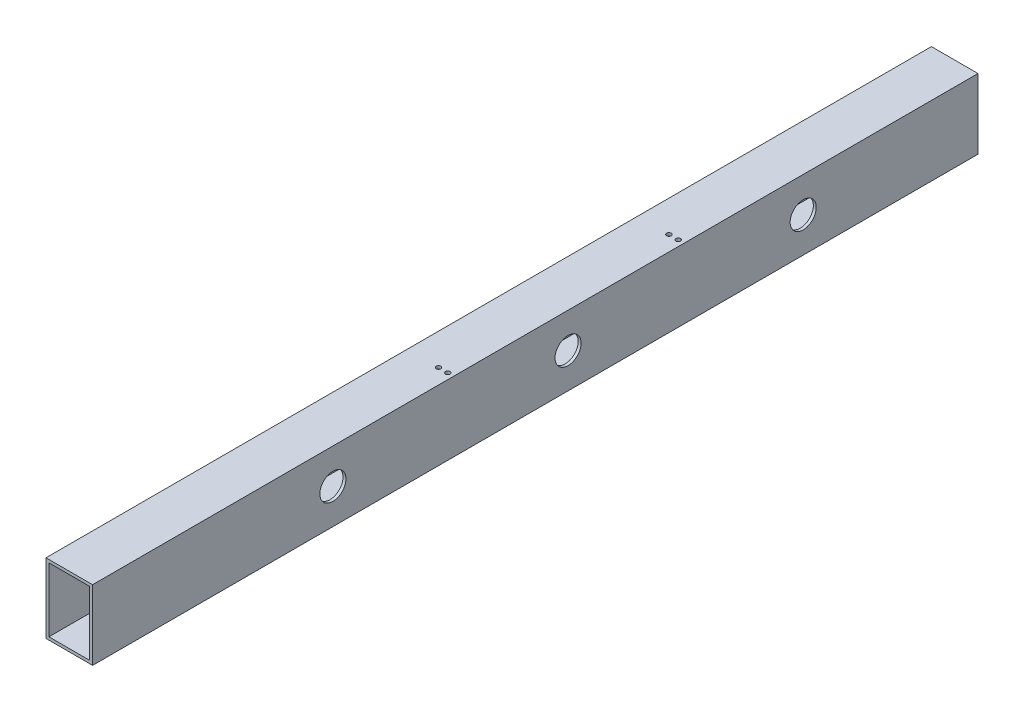
ISO-10303-21;
HEADER;
FILE_DESCRIPTION(('STEP AP214'),'2;1');
FILE_NAME('part.step','',(''),(''),'','','');
FILE_SCHEMA(('AUTOMOTIVE_DESIGN { 1 0 10303 214 1 1 1 1 }'));
ENDSEC;
DATA;
#1=APPLICATION_CONTEXT('core data for automotive mechanical design processes');
#2=APPLICATION_PROTOCOL_DEFINITION('international standard','automotive_design',2000,#1);
#3=PRODUCT_CONTEXT('',#1,'mechanical');
#4=PRODUCT('Part','Part','',(#3));
#5=PRODUCT_RELATED_PRODUCT_CATEGORY('part','',(#4));
#6=PRODUCT_DEFINITION_FORMATION('','',#4);
#7=PRODUCT_DEFINITION_CONTEXT('part definition',#1,'design');
#8=PRODUCT_DEFINITION('design','',#6,#7);
#9=PRODUCT_DEFINITION_SHAPE('','',#8);
#10=(LENGTH_UNIT() NAMED_UNIT(*) SI_UNIT(.MILLI.,.METRE.));
#11=(NAMED_UNIT(*) PLANE_ANGLE_UNIT() SI_UNIT($,.RADIAN.));
#12=(NAMED_UNIT(*) SI_UNIT($,.STERADIAN.) SOLID_ANGLE_UNIT());
#13=UNCERTAINTY_MEASURE_WITH_UNIT(LENGTH_MEASURE(1.E-05),#10,'distance_accuracy_value','');
#14=(GEOMETRIC_REPRESENTATION_CONTEXT(3) GLOBAL_UNCERTAINTY_ASSIGNED_CONTEXT((#13)) GLOBAL_UNIT_ASSIGNED_CONTEXT((#10,
#11,#12)) REPRESENTATION_CONTEXT('',''));
#15=CARTESIAN_POINT('',(0.,0.,0.));
#16=DIRECTION('',(0.,0.,1.));
#17=DIRECTION('',(1.,0.,0.));
#18=AXIS2_PLACEMENT_3D('',#15,#16,#17);
#19=CARTESIAN_POINT('',(0.,0.,965.2));
#20=DIRECTION('',(0.,0.,1.));
#21=DIRECTION('',(1.,0.,0.));
#22=AXIS2_PLACEMENT_3D('',#19,#20,#21);
#23=PLANE('',#22);
#24=DIRECTION('',(0.,1.,0.));
#25=VECTOR('',#24,1.);
#26=CARTESIAN_POINT('',(25.4,38.1,965.2));
#27=LINE('',#26,#25);
#28=CARTESIAN_POINT('',(25.4,-38.1,965.2));
#29=VERTEX_POINT('',#28);
#30=CARTESIAN_POINT('',(25.4,38.1,965.2));
#31=VERTEX_POINT('',#30);
#32=EDGE_CURVE('E141',#29,#31,#27,.T.);
#33=ORIENTED_EDGE('',*,*,#32,.T.);
#34=DIRECTION('',(-1.,0.,0.));
#35=VECTOR('',#34,1.);
#36=CARTESIAN_POINT('',(-25.4,38.1,965.2));
#37=LINE('',#36,#35);
#38=CARTESIAN_POINT('',(-25.4,38.1,965.2));
#39=VERTEX_POINT('',#38);
#40=EDGE_CURVE('E144',#31,#39,#37,.T.);
#41=ORIENTED_EDGE('',*,*,#40,.T.);
#42=DIRECTION('',(0.,-1.,0.));
#43=VECTOR('',#42,1.);
#44=CARTESIAN_POINT('',(-25.4,38.1,965.2));
#45=LINE('',#44,#43);
#46=CARTESIAN_POINT('',(-25.3999999999999,-38.1,965.2));
#47=VERTEX_POINT('',#46);
#48=EDGE_CURVE('E147',#39,#47,#45,.T.);
#49=ORIENTED_EDGE('',*,*,#48,.T.);
#50=DIRECTION('',(1.,0.,0.));
#51=VECTOR('',#50,1.);
#52=CARTESIAN_POINT('',(-25.3999999999999,-38.1,965.2));
#53=LINE('',#52,#51);
#54=EDGE_CURVE('E149',#47,#29,#53,.T.);
#55=ORIENTED_EDGE('',*,*,#54,.T.);
#56=EDGE_LOOP('',(#33,#41,#49,#55));
#57=FACE_BOUND('',#56,.T.);
#58=DIRECTION('',(1.,0.,0.));
#59=VECTOR('',#58,1.);
#60=CARTESIAN_POINT('',(-22.225,-34.925,965.2));
#61=LINE('',#60,#59);
#62=CARTESIAN_POINT('',(-22.225,-34.925,965.2));
#63=VERTEX_POINT('',#62);
#64=CARTESIAN_POINT('',(22.225,-34.925,965.2));
#65=VERTEX_POINT('',#64);
#66=EDGE_CURVE('E111',#63,#65,#61,.T.);
#67=ORIENTED_EDGE('',*,*,#66,.F.);
#68=DIRECTION('',(0.,-1.,0.));
#69=VECTOR('',#68,1.);
#70=CARTESIAN_POINT('',(-22.225,34.925,965.2));
#71=LINE('',#70,#69);
#72=CARTESIAN_POINT('',(-22.225,34.925,965.2));
#73=VERTEX_POINT('',#72);
#74=EDGE_CURVE('E103',#73,#63,#71,.T.);
#75=ORIENTED_EDGE('',*,*,#74,.F.);
#76=DIRECTION('',(-1.,0.,0.));
#77=VECTOR('',#76,1.);
#78=CARTESIAN_POINT('',(-22.225,34.925,965.2));
#79=LINE('',#78,#77);
#80=CARTESIAN_POINT('',(22.225,34.925,965.2));
#81=VERTEX_POINT('',#80);
#82=EDGE_CURVE('E125',#81,#73,#79,.T.);
#83=ORIENTED_EDGE('',*,*,#82,.F.);
#84=DIRECTION('',(0.,1.,0.));
#85=VECTOR('',#84,1.);
#86=CARTESIAN_POINT('',(22.225,34.925,965.2));
#87=LINE('',#86,#85);
#88=EDGE_CURVE('E123',#65,#81,#87,.T.);
#89=ORIENTED_EDGE('',*,*,#88,.F.);
#90=EDGE_LOOP('',(#67,#75,#83,#89));
#91=FACE_BOUND('',#90,.T.);
#92=ADVANCED_FACE('F36',(#57,#91),#23,.T.);
#93=CARTESIAN_POINT('',(0.,0.,0.));
#94=DIRECTION('',(0.,0.,1.));
#95=DIRECTION('',(1.,0.,0.));
#96=AXIS2_PLACEMENT_3D('',#93,#94,#95);
#97=PLANE('',#96);
#98=DIRECTION('',(0.,1.,0.));
#99=VECTOR('',#98,1.);
#100=CARTESIAN_POINT('',(25.4,38.1,0.));
#101=LINE('',#100,#99);
#102=CARTESIAN_POINT('',(25.4,-38.1,0.));
#103=VERTEX_POINT('',#102);
#104=CARTESIAN_POINT('',(25.4,38.1,0.));
#105=VERTEX_POINT('',#104);
#106=EDGE_CURVE('E119',#103,#105,#101,.T.);
#107=ORIENTED_EDGE('',*,*,#106,.F.);
#108=DIRECTION('',(1.,0.,0.));
#109=VECTOR('',#108,1.);
#110=CARTESIAN_POINT('',(-25.3999999999999,-38.1,0.));
#111=LINE('',#110,#109);
#112=CARTESIAN_POINT('',(-25.3999999999999,-38.1,0.));
#113=VERTEX_POINT('',#112);
#114=EDGE_CURVE('E145',#113,#103,#111,.T.);
#115=ORIENTED_EDGE('',*,*,#114,.F.);
#116=DIRECTION('',(0.,-1.,0.));
#117=VECTOR('',#116,1.);
#118=CARTESIAN_POINT('',(-25.4,38.1,0.));
#119=LINE('',#118,#117);
#120=CARTESIAN_POINT('',(-25.4,38.1,0.));
#121=VERTEX_POINT('',#120);
#122=EDGE_CURVE('E156',#121,#113,#119,.T.);
#123=ORIENTED_EDGE('',*,*,#122,.F.);
#124=DIRECTION('',(-1.,0.,0.));
#125=VECTOR('',#124,1.);
#126=CARTESIAN_POINT('',(-25.4,38.1,0.));
#127=LINE('',#126,#125);
#128=EDGE_CURVE('E154',#105,#121,#127,.T.);
#129=ORIENTED_EDGE('',*,*,#128,.F.);
#130=EDGE_LOOP('',(#107,#115,#123,#129));
#131=FACE_BOUND('',#130,.T.);
#132=DIRECTION('',(0.,-1.,0.));
#133=VECTOR('',#132,1.);
#134=CARTESIAN_POINT('',(-22.225,34.925,0.));
#135=LINE('',#134,#133);
#136=CARTESIAN_POINT('',(-22.225,34.925,0.));
#137=VERTEX_POINT('',#136);
#138=CARTESIAN_POINT('',(-22.225,-34.925,0.));
#139=VERTEX_POINT('',#138);
#140=EDGE_CURVE('E61',#137,#139,#135,.T.);
#141=ORIENTED_EDGE('',*,*,#140,.T.);
#142=DIRECTION('',(1.,0.,0.));
#143=VECTOR('',#142,1.);
#144=CARTESIAN_POINT('',(-22.225,-34.925,0.));
#145=LINE('',#144,#143);
#146=CARTESIAN_POINT('',(22.225,-34.925,0.));
#147=VERTEX_POINT('',#146);
#148=EDGE_CURVE('E118',#139,#147,#145,.T.);
#149=ORIENTED_EDGE('',*,*,#148,.T.);
#150=DIRECTION('',(0.,1.,0.));
#151=VECTOR('',#150,1.);
#152=CARTESIAN_POINT('',(22.225,34.925,0.));
#153=LINE('',#152,#151);
#154=CARTESIAN_POINT('',(22.225,34.925,0.));
#155=VERTEX_POINT('',#154);
#156=EDGE_CURVE('E133',#147,#155,#153,.T.);
#157=ORIENTED_EDGE('',*,*,#156,.T.);
#158=DIRECTION('',(-1.,0.,0.));
#159=VECTOR('',#158,1.);
#160=CARTESIAN_POINT('',(-22.225,34.925,0.));
#161=LINE('',#160,#159);
#162=EDGE_CURVE('E112',#155,#137,#161,.T.);
#163=ORIENTED_EDGE('',*,*,#162,.T.);
#164=EDGE_LOOP('',(#141,#149,#157,#163));
#165=FACE_BOUND('',#164,.T.);
#166=ADVANCED_FACE('F203',(#131,#165),#97,.F.);
#167=CARTESIAN_POINT('',(25.4,38.1,965.2));
#168=DIRECTION('',(-1.,0.,0.));
#169=DIRECTION('',(0.,-1.,0.));
#170=AXIS2_PLACEMENT_3D('',#167,#168,#169);
#171=PLANE('',#170);
#172=CARTESIAN_POINT('',(25.4,0.,703.246600732606));
#173=DIRECTION('',(1.,0.,0.));
#174=DIRECTION('',(0.,1.,0.));
#175=AXIS2_PLACEMENT_3D('',#172,#173,#174);
#176=CIRCLE('',#175,14.2240000000001);
#177=CARTESIAN_POINT('',(25.4,14.2240000000001,703.246600732606));
#178=VERTEX_POINT('',#177);
#179=EDGE_CURVE('E285',#178,#178,#176,.T.);
#180=ORIENTED_EDGE('',*,*,#179,.F.);
#181=EDGE_LOOP('',(#180));
#182=FACE_BOUND('',#181,.T.);
#183=CARTESIAN_POINT('',(25.4,0.,190.549048410685));
#184=DIRECTION('',(1.,0.,0.));
#185=DIRECTION('',(0.,1.,0.));
#186=AXIS2_PLACEMENT_3D('',#183,#184,#185);
#187=CIRCLE('',#186,14.224);
#188=CARTESIAN_POINT('',(25.4,14.224,190.549048410685));
#189=VERTEX_POINT('',#188);
#190=EDGE_CURVE('E291',#189,#189,#187,.T.);
#191=ORIENTED_EDGE('',*,*,#190,.F.);
#192=EDGE_LOOP('',(#191));
#193=FACE_BOUND('',#192,.T.);
#194=CARTESIAN_POINT('',(25.4,0.,446.897824571646));
#195=DIRECTION('',(1.,0.,0.));
#196=DIRECTION('',(0.,1.,0.));
#197=AXIS2_PLACEMENT_3D('',#194,#195,#196);
#198=CIRCLE('',#197,14.224);
#199=CARTESIAN_POINT('',(25.4,14.224,446.897824571646));
#200=VERTEX_POINT('',#199);
#201=EDGE_CURVE('E277',#200,#200,#198,.T.);
#202=ORIENTED_EDGE('',*,*,#201,.F.);
#203=EDGE_LOOP('',(#202));
#204=FACE_BOUND('',#203,.T.);
#205=ORIENTED_EDGE('',*,*,#106,.T.);
#206=DIRECTION('',(0.,0.,-1.));
#207=VECTOR('',#206,1.);
#208=CARTESIAN_POINT('',(25.4,38.1,965.2));
#209=LINE('',#208,#207);
#210=EDGE_CURVE('E11',#31,#105,#209,.T.);
#211=ORIENTED_EDGE('',*,*,#210,.F.);
#212=ORIENTED_EDGE('',*,*,#32,.F.);
#213=DIRECTION('',(0.,0.,-1.));
#214=VECTOR('',#213,1.);
#215=CARTESIAN_POINT('',(25.4,-38.1,965.2));
#216=LINE('',#215,#214);
#217=EDGE_CURVE('E151',#29,#103,#216,.T.);
#218=ORIENTED_EDGE('',*,*,#217,.T.);
#219=EDGE_LOOP('',(#205,#211,#212,#218));
#220=FACE_BOUND('',#219,.T.);
#221=ADVANCED_FACE('F38',(#182,#193,#204,#220),#171,.F.);
#222=CARTESIAN_POINT('',(-25.4,38.1,965.2));
#223=DIRECTION('',(0.,-1.,0.));
#224=DIRECTION('',(0.,0.,-1.));
#225=AXIS2_PLACEMENT_3D('',#222,#223,#224);
#226=PLANE('',#225);
#227=CARTESIAN_POINT('',(8.88999999999853,38.1,320.473808194258));
#228=DIRECTION('',(0.,1.,0.));
#229=DIRECTION('',(0.,0.,-1.));
#230=AXIS2_PLACEMENT_3D('',#227,#228,#229);
#231=CIRCLE('',#230,2.50063000000005);
#232=CARTESIAN_POINT('',(8.88999999999853,38.1,317.973178194258));
#233=VERTEX_POINT('',#232);
#234=EDGE_CURVE('E247',#233,#233,#231,.T.);
#235=ORIENTED_EDGE('',*,*,#234,.F.);
#236=EDGE_LOOP('',(#235));
#237=FACE_BOUND('',#236,.T.);
#238=CARTESIAN_POINT('',(19.0499999999985,38.1,320.473808194258));
#239=DIRECTION('',(0.,1.,0.));
#240=DIRECTION('',(0.,0.,-1.));
#241=AXIS2_PLACEMENT_3D('',#238,#239,#240);
#242=CIRCLE('',#241,2.50063000000003);
#243=CARTESIAN_POINT('',(19.0499999999985,38.1,317.973178194258));
#244=VERTEX_POINT('',#243);
#245=EDGE_CURVE('E251',#244,#244,#242,.T.);
#246=ORIENTED_EDGE('',*,*,#245,.F.);
#247=EDGE_LOOP('',(#246));
#248=FACE_BOUND('',#247,.T.);
#249=CARTESIAN_POINT('',(19.0499999999999,38.1,571.614708402377));
#250=DIRECTION('',(0.,1.,0.));
#251=DIRECTION('',(0.,0.,1.));
#252=AXIS2_PLACEMENT_3D('',#249,#250,#251);
#253=CIRCLE('',#252,2.50063000000002);
#254=CARTESIAN_POINT('',(19.0499999999999,38.1,574.115338402377));
#255=VERTEX_POINT('',#254);
#256=EDGE_CURVE('E255',#255,#255,#253,.T.);
#257=ORIENTED_EDGE('',*,*,#256,.F.);
#258=EDGE_LOOP('',(#257));
#259=FACE_BOUND('',#258,.T.);
#260=CARTESIAN_POINT('',(8.8899999999999,38.1,571.614708402377));
#261=DIRECTION('',(0.,1.,0.));
#262=DIRECTION('',(0.,0.,1.));
#263=AXIS2_PLACEMENT_3D('',#260,#261,#262);
#264=CIRCLE('',#263,2.50063000000004);
#265=CARTESIAN_POINT('',(8.8899999999999,38.1,574.115338402377));
#266=VERTEX_POINT('',#265);
#267=EDGE_CURVE('E259',#266,#266,#264,.T.);
#268=ORIENTED_EDGE('',*,*,#267,.F.);
#269=EDGE_LOOP('',(#268));
#270=FACE_BOUND('',#269,.T.);
#271=ORIENTED_EDGE('',*,*,#128,.T.);
#272=DIRECTION('',(0.,0.,-1.));
#273=VECTOR('',#272,1.);
#274=CARTESIAN_POINT('',(-25.4,38.1,965.2));
#275=LINE('',#274,#273);
#276=EDGE_CURVE('E45',#39,#121,#275,.T.);
#277=ORIENTED_EDGE('',*,*,#276,.F.);
#278=ORIENTED_EDGE('',*,*,#40,.F.);
#279=ORIENTED_EDGE('',*,*,#210,.T.);
#280=EDGE_LOOP('',(#271,#277,#278,#279));
#281=FACE_BOUND('',#280,.T.);
#282=ADVANCED_FACE('F236',(#237,#248,#259,#270,#281),#226,.F.);
#283=CARTESIAN_POINT('',(-25.4,38.1,965.2));
#284=DIRECTION('',(1.,0.,0.));
#285=DIRECTION('',(0.,1.,0.));
#286=AXIS2_PLACEMENT_3D('',#283,#284,#285);
#287=PLANE('',#286);
#288=CARTESIAN_POINT('',(-25.4,0.,703.246600732606));
#289=DIRECTION('',(1.,0.,0.));
#290=DIRECTION('',(0.,1.,0.));
#291=AXIS2_PLACEMENT_3D('',#288,#289,#290);
#292=CIRCLE('',#291,14.2240000000001);
#293=CARTESIAN_POINT('',(-25.4,14.224,703.246600732606));
#294=VERTEX_POINT('',#293);
#295=EDGE_CURVE('E169',#294,#294,#292,.F.);
#296=ORIENTED_EDGE('',*,*,#295,.F.);
#297=EDGE_LOOP('',(#296));
#298=FACE_BOUND('',#297,.T.);
#299=CARTESIAN_POINT('',(-25.4,0.,190.549048410685));
#300=DIRECTION('',(1.,0.,0.));
#301=DIRECTION('',(0.,1.,0.));
#302=AXIS2_PLACEMENT_3D('',#299,#300,#301);
#303=CIRCLE('',#302,14.224);
#304=CARTESIAN_POINT('',(-25.4,14.224,190.549048410685));
#305=VERTEX_POINT('',#304);
#306=EDGE_CURVE('E288',#305,#305,#303,.F.);
#307=ORIENTED_EDGE('',*,*,#306,.F.);
#308=EDGE_LOOP('',(#307));
#309=FACE_BOUND('',#308,.T.);
#310=CARTESIAN_POINT('',(-25.4,0.,446.897824571646));
#311=DIRECTION('',(1.,0.,0.));
#312=DIRECTION('',(0.,1.,0.));
#313=AXIS2_PLACEMENT_3D('',#310,#311,#312);
#314=CIRCLE('',#313,14.224);
#315=CARTESIAN_POINT('',(-25.4,14.224,446.897824571646));
#316=VERTEX_POINT('',#315);
#317=EDGE_CURVE('E182',#316,#316,#314,.F.);
#318=ORIENTED_EDGE('',*,*,#317,.F.);
#319=EDGE_LOOP('',(#318));
#320=FACE_BOUND('',#319,.T.);
#321=ORIENTED_EDGE('',*,*,#122,.T.);
#322=DIRECTION('',(0.,0.,-1.));
#323=VECTOR('',#322,1.);
#324=CARTESIAN_POINT('',(-25.3999999999999,-38.1,965.2));
#325=LINE('',#324,#323);
#326=EDGE_CURVE('E161',#47,#113,#325,.T.);
#327=ORIENTED_EDGE('',*,*,#326,.F.);
#328=ORIENTED_EDGE('',*,*,#48,.F.);
#329=ORIENTED_EDGE('',*,*,#276,.T.);
#330=EDGE_LOOP('',(#321,#327,#328,#329));
#331=FACE_BOUND('',#330,.T.);
#332=ADVANCED_FACE('F233',(#298,#309,#320,#331),#287,.F.);
#333=CARTESIAN_POINT('',(-25.3999999999999,-38.1,965.2));
#334=DIRECTION('',(0.,1.,0.));
#335=DIRECTION('',(0.,0.,1.));
#336=AXIS2_PLACEMENT_3D('',#333,#334,#335);
#337=PLANE('',#336);
#338=ORIENTED_EDGE('',*,*,#114,.T.);
#339=ORIENTED_EDGE('',*,*,#217,.F.);
#340=ORIENTED_EDGE('',*,*,#54,.F.);
#341=ORIENTED_EDGE('',*,*,#326,.T.);
#342=EDGE_LOOP('',(#338,#339,#340,#341));
#343=FACE_BOUND('',#342,.T.);
#344=ADVANCED_FACE('F230',(#343),#337,.F.);
#345=CARTESIAN_POINT('',(-22.225,34.925,965.2));
#346=DIRECTION('',(1.,0.,0.));
#347=DIRECTION('',(0.,1.,0.));
#348=AXIS2_PLACEMENT_3D('',#345,#346,#347);
#349=PLANE('',#348);
#350=CARTESIAN_POINT('',(-22.225,0.,703.246600732606));
#351=DIRECTION('',(1.,0.,0.));
#352=DIRECTION('',(0.,1.,0.));
#353=AXIS2_PLACEMENT_3D('',#350,#351,#352);
#354=CIRCLE('',#353,14.2240000000001);
#355=CARTESIAN_POINT('',(-22.225,14.224,703.246600732606));
#356=VERTEX_POINT('',#355);
#357=EDGE_CURVE('E131',#356,#356,#354,.T.);
#358=ORIENTED_EDGE('',*,*,#357,.F.);
#359=EDGE_LOOP('',(#358));
#360=FACE_BOUND('',#359,.T.);
#361=CARTESIAN_POINT('',(-22.225,0.,190.549048410685));
#362=DIRECTION('',(1.,0.,0.));
#363=DIRECTION('',(0.,1.,0.));
#364=AXIS2_PLACEMENT_3D('',#361,#362,#363);
#365=CIRCLE('',#364,14.224);
#366=CARTESIAN_POINT('',(-22.225,14.224,190.549048410685));
#367=VERTEX_POINT('',#366);
#368=EDGE_CURVE('E172',#367,#367,#365,.T.);
#369=ORIENTED_EDGE('',*,*,#368,.F.);
#370=EDGE_LOOP('',(#369));
#371=FACE_BOUND('',#370,.T.);
#372=CARTESIAN_POINT('',(-22.225,0.,446.897824571646));
#373=DIRECTION('',(1.,0.,0.));
#374=DIRECTION('',(0.,1.,0.));
#375=AXIS2_PLACEMENT_3D('',#372,#373,#374);
#376=CIRCLE('',#375,14.224);
#377=CARTESIAN_POINT('',(-22.225,14.224,446.897824571646));
#378=VERTEX_POINT('',#377);
#379=EDGE_CURVE('E168',#378,#378,#376,.T.);
#380=ORIENTED_EDGE('',*,*,#379,.F.);
#381=EDGE_LOOP('',(#380));
#382=FACE_BOUND('',#381,.T.);
#383=ORIENTED_EDGE('',*,*,#140,.F.);
#384=DIRECTION('',(0.,0.,-1.));
#385=VECTOR('',#384,1.);
#386=CARTESIAN_POINT('',(-22.225,34.925,965.2));
#387=LINE('',#386,#385);
#388=EDGE_CURVE('E107',#73,#137,#387,.T.);
#389=ORIENTED_EDGE('',*,*,#388,.F.);
#390=ORIENTED_EDGE('',*,*,#74,.T.);
#391=DIRECTION('',(0.,0.,-1.));
#392=VECTOR('',#391,1.);
#393=CARTESIAN_POINT('',(-22.225,-34.925,965.2));
#394=LINE('',#393,#392);
#395=EDGE_CURVE('E106',#63,#139,#394,.T.);
#396=ORIENTED_EDGE('',*,*,#395,.T.);
#397=EDGE_LOOP('',(#383,#389,#390,#396));
#398=FACE_BOUND('',#397,.T.);
#399=ADVANCED_FACE('F105',(#360,#371,#382,#398),#349,.T.);
#400=CARTESIAN_POINT('',(-22.225,-34.925,965.2));
#401=DIRECTION('',(0.,1.,0.));
#402=DIRECTION('',(-1.,0.,0.));
#403=AXIS2_PLACEMENT_3D('',#400,#401,#402);
#404=PLANE('',#403);
#405=ORIENTED_EDGE('',*,*,#148,.F.);
#406=ORIENTED_EDGE('',*,*,#395,.F.);
#407=ORIENTED_EDGE('',*,*,#66,.T.);
#408=DIRECTION('',(0.,0.,-1.));
#409=VECTOR('',#408,1.);
#410=CARTESIAN_POINT('',(22.225,-34.925,965.2));
#411=LINE('',#410,#409);
#412=EDGE_CURVE('E120',#65,#147,#411,.T.);
#413=ORIENTED_EDGE('',*,*,#412,.T.);
#414=EDGE_LOOP('',(#405,#406,#407,#413));
#415=FACE_BOUND('',#414,.T.);
#416=ADVANCED_FACE('F115',(#415),#404,.T.);
#417=CARTESIAN_POINT('',(22.225,34.925,965.2));
#418=DIRECTION('',(-1.,0.,0.));
#419=DIRECTION('',(0.,-1.,0.));
#420=AXIS2_PLACEMENT_3D('',#417,#418,#419);
#421=PLANE('',#420);
#422=CARTESIAN_POINT('',(22.225,0.,703.246600732606));
#423=DIRECTION('',(-1.,0.,0.));
#424=DIRECTION('',(0.,-1.,0.));
#425=AXIS2_PLACEMENT_3D('',#422,#423,#424);
#426=CIRCLE('',#425,14.2240000000001);
#427=CARTESIAN_POINT('',(22.225,-14.224,703.246600732606));
#428=VERTEX_POINT('',#427);
#429=EDGE_CURVE('E40',#428,#428,#426,.T.);
#430=ORIENTED_EDGE('',*,*,#429,.F.);
#431=EDGE_LOOP('',(#430));
#432=FACE_BOUND('',#431,.T.);
#433=CARTESIAN_POINT('',(22.225,0.,190.549048410685));
#434=DIRECTION('',(-1.,0.,0.));
#435=DIRECTION('',(0.,-1.,0.));
#436=AXIS2_PLACEMENT_3D('',#433,#434,#435);
#437=CIRCLE('',#436,14.224);
#438=CARTESIAN_POINT('',(22.225,-14.224,190.549048410685));
#439=VERTEX_POINT('',#438);
#440=EDGE_CURVE('E170',#439,#439,#437,.T.);
#441=ORIENTED_EDGE('',*,*,#440,.F.);
#442=EDGE_LOOP('',(#441));
#443=FACE_BOUND('',#442,.T.);
#444=CARTESIAN_POINT('',(22.225,0.,446.897824571646));
#445=DIRECTION('',(-1.,0.,0.));
#446=DIRECTION('',(0.,-1.,0.));
#447=AXIS2_PLACEMENT_3D('',#444,#445,#446);
#448=CIRCLE('',#447,14.224);
#449=CARTESIAN_POINT('',(22.225,-14.224,446.897824571646));
#450=VERTEX_POINT('',#449);
#451=EDGE_CURVE('E166',#450,#450,#448,.T.);
#452=ORIENTED_EDGE('',*,*,#451,.F.);
#453=EDGE_LOOP('',(#452));
#454=FACE_BOUND('',#453,.T.);
#455=ORIENTED_EDGE('',*,*,#156,.F.);
#456=ORIENTED_EDGE('',*,*,#412,.F.);
#457=ORIENTED_EDGE('',*,*,#88,.T.);
#458=DIRECTION('',(0.,0.,-1.));
#459=VECTOR('',#458,1.);
#460=CARTESIAN_POINT('',(22.225,34.925,965.2));
#461=LINE('',#460,#459);
#462=EDGE_CURVE('E53',#81,#155,#461,.T.);
#463=ORIENTED_EDGE('',*,*,#462,.T.);
#464=EDGE_LOOP('',(#455,#456,#457,#463));
#465=FACE_BOUND('',#464,.T.);
#466=ADVANCED_FACE('F193',(#432,#443,#454,#465),#421,.T.);
#467=CARTESIAN_POINT('',(-22.225,34.925,965.2));
#468=DIRECTION('',(0.,-1.,0.));
#469=DIRECTION('',(1.,0.,0.));
#470=AXIS2_PLACEMENT_3D('',#467,#468,#469);
#471=PLANE('',#470);
#472=CARTESIAN_POINT('',(8.88999999999853,34.925,320.473808194258));
#473=DIRECTION('',(0.,-1.,0.));
#474=DIRECTION('',(1.,0.,0.));
#475=AXIS2_PLACEMENT_3D('',#472,#473,#474);
#476=CIRCLE('',#475,2.50063000000005);
#477=CARTESIAN_POINT('',(11.3906299999986,34.925,320.473808194258));
#478=VERTEX_POINT('',#477);
#479=EDGE_CURVE('E282',#478,#478,#476,.F.);
#480=ORIENTED_EDGE('',*,*,#479,.T.);
#481=EDGE_LOOP('',(#480));
#482=FACE_BOUND('',#481,.T.);
#483=CARTESIAN_POINT('',(19.0499999999985,34.925,320.473808194258));
#484=DIRECTION('',(0.,-1.,0.));
#485=DIRECTION('',(1.,0.,0.));
#486=AXIS2_PLACEMENT_3D('',#483,#484,#485);
#487=CIRCLE('',#486,2.50063000000003);
#488=CARTESIAN_POINT('',(21.5506299999986,34.925,320.473808194258));
#489=VERTEX_POINT('',#488);
#490=EDGE_CURVE('E336',#489,#489,#487,.F.);
#491=ORIENTED_EDGE('',*,*,#490,.T.);
#492=EDGE_LOOP('',(#491));
#493=FACE_BOUND('',#492,.T.);
#494=CARTESIAN_POINT('',(19.0499999999999,34.925,571.614708402377));
#495=DIRECTION('',(0.,-1.,0.));
#496=DIRECTION('',(1.,0.,0.));
#497=AXIS2_PLACEMENT_3D('',#494,#495,#496);
#498=CIRCLE('',#497,2.50063000000002);
#499=CARTESIAN_POINT('',(21.5506299999999,34.925,571.614708402377));
#500=VERTEX_POINT('',#499);
#501=EDGE_CURVE('E274',#500,#500,#498,.F.);
#502=ORIENTED_EDGE('',*,*,#501,.T.);
#503=EDGE_LOOP('',(#502));
#504=FACE_BOUND('',#503,.T.);
#505=CARTESIAN_POINT('',(8.8899999999999,34.925,571.614708402377));
#506=DIRECTION('',(0.,-1.,0.));
#507=DIRECTION('',(1.,0.,0.));
#508=AXIS2_PLACEMENT_3D('',#505,#506,#507);
#509=CIRCLE('',#508,2.50063000000004);
#510=CARTESIAN_POINT('',(11.3906299999999,34.925,571.614708402377));
#511=VERTEX_POINT('',#510);
#512=EDGE_CURVE('E273',#511,#511,#509,.F.);
#513=ORIENTED_EDGE('',*,*,#512,.T.);
#514=EDGE_LOOP('',(#513));
#515=FACE_BOUND('',#514,.T.);
#516=ORIENTED_EDGE('',*,*,#162,.F.);
#517=ORIENTED_EDGE('',*,*,#462,.F.);
#518=ORIENTED_EDGE('',*,*,#82,.T.);
#519=ORIENTED_EDGE('',*,*,#388,.T.);
#520=EDGE_LOOP('',(#516,#517,#518,#519));
#521=FACE_BOUND('',#520,.T.);
#522=ADVANCED_FACE('F196',(#482,#493,#504,#515,#521),#471,.T.);
#523=CARTESIAN_POINT('',(-65.6315474223899,0.,446.897824571646));
#524=DIRECTION('',(1.,0.,0.));
#525=DIRECTION('',(0.,1.,0.));
#526=AXIS2_PLACEMENT_3D('',#523,#524,#525);
#527=CYLINDRICAL_SURFACE('',#526,14.224);
#528=ORIENTED_EDGE('',*,*,#451,.T.);
#529=EDGE_LOOP('',(#528));
#530=FACE_BOUND('',#529,.T.);
#531=ORIENTED_EDGE('',*,*,#201,.T.);
#532=EDGE_LOOP('',(#531));
#533=FACE_BOUND('',#532,.T.);
#534=ADVANCED_FACE('F205',(#530,#533),#527,.F.);
#535=CARTESIAN_POINT('',(-65.6315474223899,0.,190.549048410685));
#536=DIRECTION('',(1.,0.,0.));
#537=DIRECTION('',(0.,1.,0.));
#538=AXIS2_PLACEMENT_3D('',#535,#536,#537);
#539=CYLINDRICAL_SURFACE('',#538,14.224);
#540=ORIENTED_EDGE('',*,*,#440,.T.);
#541=EDGE_LOOP('',(#540));
#542=FACE_BOUND('',#541,.T.);
#543=ORIENTED_EDGE('',*,*,#190,.T.);
#544=EDGE_LOOP('',(#543));
#545=FACE_BOUND('',#544,.T.);
#546=ADVANCED_FACE('F213',(#542,#545),#539,.F.);
#547=CARTESIAN_POINT('',(-65.6315474223899,0.,703.246600732606));
#548=DIRECTION('',(1.,0.,0.));
#549=DIRECTION('',(0.,1.,0.));
#550=AXIS2_PLACEMENT_3D('',#547,#548,#549);
#551=CYLINDRICAL_SURFACE('',#550,14.2240000000001);
#552=ORIENTED_EDGE('',*,*,#429,.T.);
#553=EDGE_LOOP('',(#552));
#554=FACE_BOUND('',#553,.T.);
#555=ORIENTED_EDGE('',*,*,#179,.T.);
#556=EDGE_LOOP('',(#555));
#557=FACE_BOUND('',#556,.T.);
#558=ADVANCED_FACE('F190',(#554,#557),#551,.F.);
#559=ORIENTED_EDGE('',*,*,#379,.T.);
#560=EDGE_LOOP('',(#559));
#561=FACE_BOUND('',#560,.T.);
#562=ORIENTED_EDGE('',*,*,#317,.T.);
#563=EDGE_LOOP('',(#562));
#564=FACE_BOUND('',#563,.T.);
#565=ADVANCED_FACE('F216',(#561,#564),#527,.F.);
#566=ORIENTED_EDGE('',*,*,#368,.T.);
#567=EDGE_LOOP('',(#566));
#568=FACE_BOUND('',#567,.T.);
#569=ORIENTED_EDGE('',*,*,#306,.T.);
#570=EDGE_LOOP('',(#569));
#571=FACE_BOUND('',#570,.T.);
#572=ADVANCED_FACE('F303',(#568,#571),#539,.F.);
#573=ORIENTED_EDGE('',*,*,#357,.T.);
#574=EDGE_LOOP('',(#573));
#575=FACE_BOUND('',#574,.T.);
#576=ORIENTED_EDGE('',*,*,#295,.T.);
#577=EDGE_LOOP('',(#576));
#578=FACE_BOUND('',#577,.T.);
#579=ADVANCED_FACE('F308',(#575,#578),#551,.F.);
#580=CARTESIAN_POINT('',(8.8899999999999,27.8521502790458,571.614708402377));
#581=DIRECTION('',(0.,1.,0.));
#582=DIRECTION('',(0.,0.,1.));
#583=AXIS2_PLACEMENT_3D('',#580,#581,#582);
#584=CYLINDRICAL_SURFACE('',#583,2.50063000000004);
#585=ORIENTED_EDGE('',*,*,#267,.T.);
#586=EDGE_LOOP('',(#585));
#587=FACE_BOUND('',#586,.T.);
#588=ORIENTED_EDGE('',*,*,#512,.F.);
#589=EDGE_LOOP('',(#588));
#590=FACE_BOUND('',#589,.T.);
#591=ADVANCED_FACE('F314',(#587,#590),#584,.F.);
#592=CARTESIAN_POINT('',(19.0499999999999,27.8521502790458,571.614708402377));
#593=DIRECTION('',(0.,1.,0.));
#594=DIRECTION('',(0.,0.,1.));
#595=AXIS2_PLACEMENT_3D('',#592,#593,#594);
#596=CYLINDRICAL_SURFACE('',#595,2.50063000000002);
#597=ORIENTED_EDGE('',*,*,#256,.T.);
#598=EDGE_LOOP('',(#597));
#599=FACE_BOUND('',#598,.T.);
#600=ORIENTED_EDGE('',*,*,#501,.F.);
#601=EDGE_LOOP('',(#600));
#602=FACE_BOUND('',#601,.T.);
#603=ADVANCED_FACE('F317',(#599,#602),#596,.F.);
#604=CARTESIAN_POINT('',(19.0499999999985,27.8521502790458,320.473808194258));
#605=DIRECTION('',(0.,1.,0.));
#606=DIRECTION('',(0.,0.,1.));
#607=AXIS2_PLACEMENT_3D('',#604,#605,#606);
#608=CYLINDRICAL_SURFACE('',#607,2.50063000000003);
#609=ORIENTED_EDGE('',*,*,#245,.T.);
#610=EDGE_LOOP('',(#609));
#611=FACE_BOUND('',#610,.T.);
#612=ORIENTED_EDGE('',*,*,#490,.F.);
#613=EDGE_LOOP('',(#612));
#614=FACE_BOUND('',#613,.T.);
#615=ADVANCED_FACE('F321',(#611,#614),#608,.F.);
#616=CARTESIAN_POINT('',(8.88999999999853,27.8521502790458,320.473808194258));
#617=DIRECTION('',(0.,1.,0.));
#618=DIRECTION('',(0.,0.,1.));
#619=AXIS2_PLACEMENT_3D('',#616,#617,#618);
#620=CYLINDRICAL_SURFACE('',#619,2.50063000000005);
#621=ORIENTED_EDGE('',*,*,#234,.T.);
#622=EDGE_LOOP('',(#621));
#623=FACE_BOUND('',#622,.T.);
#624=ORIENTED_EDGE('',*,*,#479,.F.);
#625=EDGE_LOOP('',(#624));
#626=FACE_BOUND('',#625,.T.);
#627=ADVANCED_FACE('F318',(#623,#626),#620,.F.);
#628=CLOSED_SHELL('',(#92,#166,#221,#282,#332,#344,#399,#416,#466,#522,#534,#546,#558,#565,#572,
#579,#591,#603,#615,#627));
#629=MANIFOLD_SOLID_BREP('B2',#628);
#630=ADVANCED_BREP_SHAPE_REPRESENTATION('',(#18,#629),#14);
#631=SHAPE_DEFINITION_REPRESENTATION(#9,#630);
ENDSEC;
END-ISO-10303-21;
